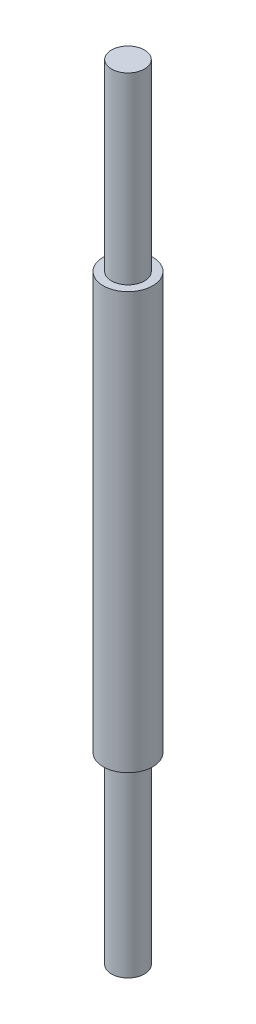
ISO-10303-21;
HEADER;
FILE_DESCRIPTION(('STEP AP214'),'2;1');
FILE_NAME('part.step','',(''),(''),'','','');
FILE_SCHEMA(('AUTOMOTIVE_DESIGN { 1 0 10303 214 1 1 1 1 }'));
ENDSEC;
DATA;
#1=APPLICATION_CONTEXT('core data for automotive mechanical design processes');
#2=APPLICATION_PROTOCOL_DEFINITION('international standard','automotive_design',2000,#1);
#3=PRODUCT_CONTEXT('',#1,'mechanical');
#4=PRODUCT('Part','Part','',(#3));
#5=PRODUCT_RELATED_PRODUCT_CATEGORY('part','',(#4));
#6=PRODUCT_DEFINITION_FORMATION('','',#4);
#7=PRODUCT_DEFINITION_CONTEXT('part definition',#1,'design');
#8=PRODUCT_DEFINITION('design','',#6,#7);
#9=PRODUCT_DEFINITION_SHAPE('','',#8);
#10=(LENGTH_UNIT() NAMED_UNIT(*) SI_UNIT(.MILLI.,.METRE.));
#11=(NAMED_UNIT(*) PLANE_ANGLE_UNIT() SI_UNIT($,.RADIAN.));
#12=(NAMED_UNIT(*) SI_UNIT($,.STERADIAN.) SOLID_ANGLE_UNIT());
#13=UNCERTAINTY_MEASURE_WITH_UNIT(LENGTH_MEASURE(1.E-05),#10,'distance_accuracy_value','');
#14=(GEOMETRIC_REPRESENTATION_CONTEXT(3) GLOBAL_UNCERTAINTY_ASSIGNED_CONTEXT((#13)) GLOBAL_UNIT_ASSIGNED_CONTEXT((#10,
#11,#12)) REPRESENTATION_CONTEXT('',''));
#15=CARTESIAN_POINT('',(0.,0.,0.));
#16=DIRECTION('',(0.,0.,1.));
#17=DIRECTION('',(1.,0.,0.));
#18=AXIS2_PLACEMENT_3D('',#15,#16,#17);
#19=CARTESIAN_POINT('',(0.,95.,0.));
#20=DIRECTION('',(0.,-1.,0.));
#21=DIRECTION('',(0.,0.,-1.));
#22=AXIS2_PLACEMENT_3D('',#19,#20,#21);
#23=CYLINDRICAL_SURFACE('',#22,4.);
#24=CARTESIAN_POINT('',(0.,50.5,0.));
#25=DIRECTION('',(0.,1.,0.));
#26=DIRECTION('',(0.,0.,1.));
#27=AXIS2_PLACEMENT_3D('',#24,#25,#26);
#28=CIRCLE('',#27,4.);
#29=CARTESIAN_POINT('',(0.,50.5,4.));
#30=VERTEX_POINT('',#29);
#31=EDGE_CURVE('E67',#30,#30,#28,.T.);
#32=ORIENTED_EDGE('',*,*,#31,.T.);
#33=EDGE_LOOP('',(#32));
#34=FACE_BOUND('',#33,.T.);
#35=CARTESIAN_POINT('',(0.,95.,0.));
#36=DIRECTION('',(0.,1.,0.));
#37=DIRECTION('',(0.,0.,1.));
#38=AXIS2_PLACEMENT_3D('',#35,#36,#37);
#39=CIRCLE('',#38,4.);
#40=CARTESIAN_POINT('',(0.,95.,4.));
#41=VERTEX_POINT('',#40);
#42=EDGE_CURVE('E50',#41,#41,#39,.T.);
#43=ORIENTED_EDGE('',*,*,#42,.F.);
#44=EDGE_LOOP('',(#43));
#45=FACE_BOUND('',#44,.T.);
#46=ADVANCED_FACE('F43',(#34,#45),#23,.T.);
#47=CARTESIAN_POINT('',(0.,95.,0.));
#48=DIRECTION('',(0.,1.,0.));
#49=DIRECTION('',(0.,0.,1.));
#50=AXIS2_PLACEMENT_3D('',#47,#48,#49);
#51=PLANE('',#50);
#52=ORIENTED_EDGE('',*,*,#42,.T.);
#53=EDGE_LOOP('',(#52));
#54=FACE_BOUND('',#53,.T.);
#55=ADVANCED_FACE('F80',(#54),#51,.T.);
#56=CARTESIAN_POINT('',(0.,50.5,0.));
#57=DIRECTION('',(0.,1.,0.));
#58=DIRECTION('',(0.,0.,1.));
#59=AXIS2_PLACEMENT_3D('',#56,#57,#58);
#60=PLANE('',#59);
#61=CARTESIAN_POINT('',(0.,50.5,0.));
#62=DIRECTION('',(0.,1.,0.));
#63=DIRECTION('',(0.,0.,1.));
#64=AXIS2_PLACEMENT_3D('',#61,#62,#63);
#65=CIRCLE('',#64,6.);
#66=CARTESIAN_POINT('',(0.,50.5,6.));
#67=VERTEX_POINT('',#66);
#68=EDGE_CURVE('E61',#67,#67,#65,.T.);
#69=ORIENTED_EDGE('',*,*,#68,.T.);
#70=EDGE_LOOP('',(#69));
#71=FACE_BOUND('',#70,.T.);
#72=ORIENTED_EDGE('',*,*,#31,.F.);
#73=EDGE_LOOP('',(#72));
#74=FACE_BOUND('',#73,.T.);
#75=ADVANCED_FACE('F77',(#71,#74),#60,.T.);
#76=CARTESIAN_POINT('',(0.,-50.5,0.));
#77=DIRECTION('',(0.,1.,0.));
#78=DIRECTION('',(0.,0.,1.));
#79=AXIS2_PLACEMENT_3D('',#76,#77,#78);
#80=PLANE('',#79);
#81=CARTESIAN_POINT('',(0.,-50.5,0.));
#82=DIRECTION('',(0.,1.,0.));
#83=DIRECTION('',(0.,0.,1.));
#84=AXIS2_PLACEMENT_3D('',#81,#82,#83);
#85=CIRCLE('',#84,6.);
#86=CARTESIAN_POINT('',(0.,-50.5,6.));
#87=VERTEX_POINT('',#86);
#88=EDGE_CURVE('E63',#87,#87,#85,.T.);
#89=ORIENTED_EDGE('',*,*,#88,.F.);
#90=EDGE_LOOP('',(#89));
#91=FACE_BOUND('',#90,.T.);
#92=CARTESIAN_POINT('',(0.,-50.5,0.));
#93=DIRECTION('',(0.,1.,0.));
#94=DIRECTION('',(0.,0.,1.));
#95=AXIS2_PLACEMENT_3D('',#92,#93,#94);
#96=CIRCLE('',#95,4.);
#97=CARTESIAN_POINT('',(0.,-50.5,4.));
#98=VERTEX_POINT('',#97);
#99=EDGE_CURVE('E10',#98,#98,#96,.T.);
#100=ORIENTED_EDGE('',*,*,#99,.T.);
#101=EDGE_LOOP('',(#100));
#102=FACE_BOUND('',#101,.T.);
#103=ADVANCED_FACE('F79',(#91,#102),#80,.F.);
#104=CARTESIAN_POINT('',(0.,50.5,0.));
#105=DIRECTION('',(0.,-1.,0.));
#106=DIRECTION('',(0.,0.,-1.));
#107=AXIS2_PLACEMENT_3D('',#104,#105,#106);
#108=CYLINDRICAL_SURFACE('',#107,6.);
#109=ORIENTED_EDGE('',*,*,#68,.F.);
#110=EDGE_LOOP('',(#109));
#111=FACE_BOUND('',#110,.T.);
#112=ORIENTED_EDGE('',*,*,#88,.T.);
#113=EDGE_LOOP('',(#112));
#114=FACE_BOUND('',#113,.T.);
#115=ADVANCED_FACE('F87',(#111,#114),#108,.T.);
#116=CARTESIAN_POINT('',(0.,-95.,0.));
#117=DIRECTION('',(0.,1.,0.));
#118=DIRECTION('',(0.,0.,1.));
#119=AXIS2_PLACEMENT_3D('',#116,#117,#118);
#120=PLANE('',#119);
#121=CARTESIAN_POINT('',(0.,-95.,0.));
#122=DIRECTION('',(0.,1.,0.));
#123=DIRECTION('',(0.,0.,1.));
#124=AXIS2_PLACEMENT_3D('',#121,#122,#123);
#125=CIRCLE('',#124,4.);
#126=CARTESIAN_POINT('',(0.,-95.,4.));
#127=VERTEX_POINT('',#126);
#128=EDGE_CURVE('E55',#127,#127,#125,.T.);
#129=ORIENTED_EDGE('',*,*,#128,.F.);
#130=EDGE_LOOP('',(#129));
#131=FACE_BOUND('',#130,.T.);
#132=ADVANCED_FACE('F96',(#131),#120,.F.);
#133=ORIENTED_EDGE('',*,*,#128,.T.);
#134=EDGE_LOOP('',(#133));
#135=FACE_BOUND('',#134,.T.);
#136=ORIENTED_EDGE('',*,*,#99,.F.);
#137=EDGE_LOOP('',(#136));
#138=FACE_BOUND('',#137,.T.);
#139=ADVANCED_FACE('F92',(#135,#138),#23,.T.);
#140=CLOSED_SHELL('',(#46,#55,#75,#103,#115,#132,#139));
#141=MANIFOLD_SOLID_BREP('B2',#140);
#142=ADVANCED_BREP_SHAPE_REPRESENTATION('',(#18,#141),#14);
#143=SHAPE_DEFINITION_REPRESENTATION(#9,#142);
ENDSEC;
END-ISO-10303-21;
